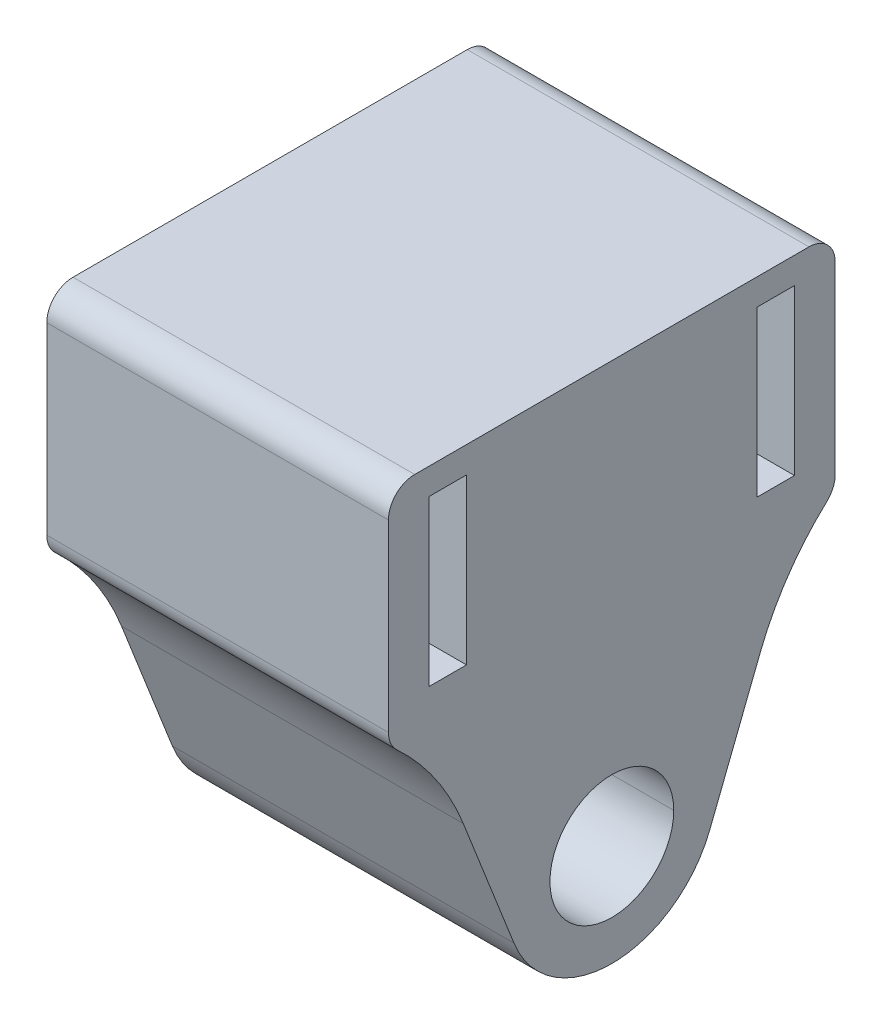
ISO-10303-21;
HEADER;
FILE_DESCRIPTION(('STEP AP214'),'2;1');
FILE_NAME('part.step','',(''),(''),'','','');
FILE_SCHEMA(('AUTOMOTIVE_DESIGN { 1 0 10303 214 1 1 1 1 }'));
ENDSEC;
DATA;
#1=APPLICATION_CONTEXT('core data for automotive mechanical design processes');
#2=APPLICATION_PROTOCOL_DEFINITION('international standard','automotive_design',2000,#1);
#3=PRODUCT_CONTEXT('',#1,'mechanical');
#4=PRODUCT('Part','Part','',(#3));
#5=PRODUCT_RELATED_PRODUCT_CATEGORY('part','',(#4));
#6=PRODUCT_DEFINITION_FORMATION('','',#4);
#7=PRODUCT_DEFINITION_CONTEXT('part definition',#1,'design');
#8=PRODUCT_DEFINITION('design','',#6,#7);
#9=PRODUCT_DEFINITION_SHAPE('','',#8);
#10=(LENGTH_UNIT() NAMED_UNIT(*) SI_UNIT(.MILLI.,.METRE.));
#11=(NAMED_UNIT(*) PLANE_ANGLE_UNIT() SI_UNIT($,.RADIAN.));
#12=(NAMED_UNIT(*) SI_UNIT($,.STERADIAN.) SOLID_ANGLE_UNIT());
#13=UNCERTAINTY_MEASURE_WITH_UNIT(LENGTH_MEASURE(1.E-05),#10,'distance_accuracy_value','');
#14=(GEOMETRIC_REPRESENTATION_CONTEXT(3) GLOBAL_UNCERTAINTY_ASSIGNED_CONTEXT((#13)) GLOBAL_UNIT_ASSIGNED_CONTEXT((#10,
#11,#12)) REPRESENTATION_CONTEXT('',''));
#15=CARTESIAN_POINT('',(0.,0.,0.));
#16=DIRECTION('',(0.,0.,1.));
#17=DIRECTION('',(1.,0.,0.));
#18=AXIS2_PLACEMENT_3D('',#15,#16,#17);
#19=CARTESIAN_POINT('',(5.,-8.06,0.));
#20=DIRECTION('',(-1.,0.,0.));
#21=DIRECTION('',(0.,0.,1.));
#22=AXIS2_PLACEMENT_3D('',#19,#20,#21);
#23=CYLINDRICAL_SURFACE('',#22,2.355);
#24=DIRECTION('',(-1.,0.,0.));
#25=VECTOR('',#24,1.);
#26=CARTESIAN_POINT('',(5.,-8.06,-2.355));
#27=LINE('',#26,#25);
#28=CARTESIAN_POINT('',(0.,-8.06,-2.355));
#29=VERTEX_POINT('',#28);
#30=CARTESIAN_POINT('',(-13.,-8.06,-2.355));
#31=VERTEX_POINT('',#30);
#32=EDGE_CURVE('E321',#29,#31,#27,.T.);
#33=ORIENTED_EDGE('',*,*,#32,.F.);
#34=CARTESIAN_POINT('',(0.,-8.06,0.));
#35=DIRECTION('',(1.,0.,0.));
#36=DIRECTION('',(0.,0.,-1.));
#37=AXIS2_PLACEMENT_3D('',#34,#35,#36);
#38=CIRCLE('',#37,2.355);
#39=CARTESIAN_POINT('',(0.,-8.06,2.355));
#40=VERTEX_POINT('',#39);
#41=EDGE_CURVE('E367',#29,#40,#38,.T.);
#42=ORIENTED_EDGE('',*,*,#41,.T.);
#43=DIRECTION('',(-1.,0.,0.));
#44=VECTOR('',#43,1.);
#45=CARTESIAN_POINT('',(5.,-8.06,2.355));
#46=LINE('',#45,#44);
#47=CARTESIAN_POINT('',(-13.,-8.06,2.355));
#48=VERTEX_POINT('',#47);
#49=EDGE_CURVE('E269',#40,#48,#46,.T.);
#50=ORIENTED_EDGE('',*,*,#49,.T.);
#51=CARTESIAN_POINT('',(-13.,-8.06,0.));
#52=DIRECTION('',(-1.,0.,0.));
#53=DIRECTION('',(0.,0.,1.));
#54=AXIS2_PLACEMENT_3D('',#51,#52,#53);
#55=CIRCLE('',#54,2.355);
#56=EDGE_CURVE('E224',#48,#31,#55,.T.);
#57=ORIENTED_EDGE('',*,*,#56,.T.);
#58=EDGE_LOOP('',(#33,#42,#50,#57));
#59=FACE_BOUND('',#58,.T.);
#60=ADVANCED_FACE('F16',(#59),#23,.F.);
#61=CARTESIAN_POINT('',(5.,6.935,-6.95));
#62=DIRECTION('',(0.,1.,0.));
#63=DIRECTION('',(0.,0.,-1.));
#64=AXIS2_PLACEMENT_3D('',#61,#62,#63);
#65=PLANE('',#64);
#66=DIRECTION('',(0.,0.,1.));
#67=VECTOR('',#66,1.);
#68=CARTESIAN_POINT('',(0.,6.935,0.));
#69=LINE('',#68,#67);
#70=CARTESIAN_POINT('',(0.,6.935,-6.95));
#71=VERTEX_POINT('',#70);
#72=CARTESIAN_POINT('',(0.,6.935,-5.53));
#73=VERTEX_POINT('',#72);
#74=EDGE_CURVE('E365',#71,#73,#69,.T.);
#75=ORIENTED_EDGE('',*,*,#74,.T.);
#76=DIRECTION('',(-1.,0.,0.));
#77=VECTOR('',#76,1.);
#78=CARTESIAN_POINT('',(5.,6.935,-5.53));
#79=LINE('',#78,#77);
#80=CARTESIAN_POINT('',(-13.,6.935,-5.53));
#81=VERTEX_POINT('',#80);
#82=EDGE_CURVE('E259',#73,#81,#79,.T.);
#83=ORIENTED_EDGE('',*,*,#82,.T.);
#84=DIRECTION('',(0.,0.,-1.));
#85=VECTOR('',#84,1.);
#86=CARTESIAN_POINT('',(-13.,6.935,-6.95));
#87=LINE('',#86,#85);
#88=CARTESIAN_POINT('',(-13.,6.935,-6.95));
#89=VERTEX_POINT('',#88);
#90=EDGE_CURVE('E425',#81,#89,#87,.T.);
#91=ORIENTED_EDGE('',*,*,#90,.T.);
#92=DIRECTION('',(-1.,0.,0.));
#93=VECTOR('',#92,1.);
#94=CARTESIAN_POINT('',(5.,6.935,-6.95));
#95=LINE('',#94,#93);
#96=EDGE_CURVE('E11',#71,#89,#95,.T.);
#97=ORIENTED_EDGE('',*,*,#96,.F.);
#98=EDGE_LOOP('',(#75,#83,#91,#97));
#99=FACE_BOUND('',#98,.T.);
#100=ADVANCED_FACE('F557',(#99),#65,.F.);
#101=CARTESIAN_POINT('',(5.,6.935,-6.95));
#102=DIRECTION('',(0.,0.,-1.));
#103=DIRECTION('',(0.,-1.,0.));
#104=AXIS2_PLACEMENT_3D('',#101,#102,#103);
#105=PLANE('',#104);
#106=DIRECTION('',(0.,1.,0.));
#107=VECTOR('',#106,1.);
#108=CARTESIAN_POINT('',(0.,-7.935,-6.95));
#109=LINE('',#108,#107);
#110=CARTESIAN_POINT('',(0.,0.675000000000008,-6.95));
#111=VERTEX_POINT('',#110);
#112=EDGE_CURVE('E377',#111,#71,#109,.T.);
#113=ORIENTED_EDGE('',*,*,#112,.T.);
#114=ORIENTED_EDGE('',*,*,#96,.T.);
#115=DIRECTION('',(0.,-1.,0.));
#116=VECTOR('',#115,1.);
#117=CARTESIAN_POINT('',(-13.,6.935,-6.95));
#118=LINE('',#117,#116);
#119=CARTESIAN_POINT('',(-13.,0.675000000000008,-6.95));
#120=VERTEX_POINT('',#119);
#121=EDGE_CURVE('E433',#89,#120,#118,.T.);
#122=ORIENTED_EDGE('',*,*,#121,.T.);
#123=DIRECTION('',(-1.,0.,0.));
#124=VECTOR('',#123,1.);
#125=CARTESIAN_POINT('',(5.,0.675000000000008,-6.95));
#126=LINE('',#125,#124);
#127=EDGE_CURVE('E27',#111,#120,#126,.T.);
#128=ORIENTED_EDGE('',*,*,#127,.F.);
#129=EDGE_LOOP('',(#113,#114,#122,#128));
#130=FACE_BOUND('',#129,.T.);
#131=ADVANCED_FACE('F530',(#130),#105,.F.);
#132=CARTESIAN_POINT('',(5.,0.675000000000008,-6.95));
#133=DIRECTION('',(0.,-1.,0.));
#134=DIRECTION('',(0.,0.,-1.));
#135=AXIS2_PLACEMENT_3D('',#132,#133,#134);
#136=PLANE('',#135);
#137=DIRECTION('',(0.,0.,-1.));
#138=VECTOR('',#137,1.);
#139=CARTESIAN_POINT('',(0.,0.675,0.));
#140=LINE('',#139,#138);
#141=CARTESIAN_POINT('',(0.,0.675,-5.53));
#142=VERTEX_POINT('',#141);
#143=EDGE_CURVE('E20',#142,#111,#140,.T.);
#144=ORIENTED_EDGE('',*,*,#143,.T.);
#145=ORIENTED_EDGE('',*,*,#127,.T.);
#146=DIRECTION('',(0.,0.,1.));
#147=VECTOR('',#146,1.);
#148=CARTESIAN_POINT('',(-13.,0.675000000000008,-6.95));
#149=LINE('',#148,#147);
#150=CARTESIAN_POINT('',(-13.,0.675,-5.53));
#151=VERTEX_POINT('',#150);
#152=EDGE_CURVE('E429',#120,#151,#149,.T.);
#153=ORIENTED_EDGE('',*,*,#152,.T.);
#154=DIRECTION('',(-1.,0.,0.));
#155=VECTOR('',#154,1.);
#156=CARTESIAN_POINT('',(5.,0.675,-5.53));
#157=LINE('',#156,#155);
#158=EDGE_CURVE('E263',#142,#151,#157,.T.);
#159=ORIENTED_EDGE('',*,*,#158,.F.);
#160=EDGE_LOOP('',(#144,#145,#153,#159));
#161=FACE_BOUND('',#160,.T.);
#162=ADVANCED_FACE('F523',(#161),#136,.F.);
#163=CARTESIAN_POINT('',(5.,6.935,-5.53));
#164=DIRECTION('',(0.,0.,1.));
#165=DIRECTION('',(0.,-1.,0.));
#166=AXIS2_PLACEMENT_3D('',#163,#164,#165);
#167=PLANE('',#166);
#168=DIRECTION('',(0.,-1.,0.));
#169=VECTOR('',#168,1.);
#170=CARTESIAN_POINT('',(0.,-7.935,-5.53));
#171=LINE('',#170,#169);
#172=EDGE_CURVE('E372',#73,#142,#171,.T.);
#173=ORIENTED_EDGE('',*,*,#172,.T.);
#174=ORIENTED_EDGE('',*,*,#158,.T.);
#175=DIRECTION('',(0.,1.,0.));
#176=VECTOR('',#175,1.);
#177=CARTESIAN_POINT('',(-13.,6.935,-5.53));
#178=LINE('',#177,#176);
#179=EDGE_CURVE('E428',#151,#81,#178,.T.);
#180=ORIENTED_EDGE('',*,*,#179,.T.);
#181=ORIENTED_EDGE('',*,*,#82,.F.);
#182=EDGE_LOOP('',(#173,#174,#180,#181));
#183=FACE_BOUND('',#182,.T.);
#184=ADVANCED_FACE('F18',(#183),#167,.F.);
#185=CARTESIAN_POINT('',(5.,6.935,5.53));
#186=DIRECTION('',(0.,1.,0.));
#187=DIRECTION('',(1.,0.,0.));
#188=AXIS2_PLACEMENT_3D('',#185,#186,#187);
#189=PLANE('',#188);
#190=DIRECTION('',(0.,0.,1.));
#191=VECTOR('',#190,1.);
#192=CARTESIAN_POINT('',(0.,6.935,0.));
#193=LINE('',#192,#191);
#194=CARTESIAN_POINT('',(0.,6.935,5.53));
#195=VERTEX_POINT('',#194);
#196=CARTESIAN_POINT('',(0.,6.935,6.95));
#197=VERTEX_POINT('',#196);
#198=EDGE_CURVE('E342',#195,#197,#193,.T.);
#199=ORIENTED_EDGE('',*,*,#198,.T.);
#200=DIRECTION('',(-1.,0.,0.));
#201=VECTOR('',#200,1.);
#202=CARTESIAN_POINT('',(5.,6.935,6.95));
#203=LINE('',#202,#201);
#204=CARTESIAN_POINT('',(-13.,6.935,6.95));
#205=VERTEX_POINT('',#204);
#206=EDGE_CURVE('E332',#197,#205,#203,.T.);
#207=ORIENTED_EDGE('',*,*,#206,.T.);
#208=DIRECTION('',(0.,0.,-1.));
#209=VECTOR('',#208,1.);
#210=CARTESIAN_POINT('',(-13.,6.935,5.53));
#211=LINE('',#210,#209);
#212=CARTESIAN_POINT('',(-13.,6.935,5.53));
#213=VERTEX_POINT('',#212);
#214=EDGE_CURVE('E293',#205,#213,#211,.T.);
#215=ORIENTED_EDGE('',*,*,#214,.T.);
#216=DIRECTION('',(-1.,0.,0.));
#217=VECTOR('',#216,1.);
#218=CARTESIAN_POINT('',(5.,6.935,5.53));
#219=LINE('',#218,#217);
#220=EDGE_CURVE('E260',#195,#213,#219,.T.);
#221=ORIENTED_EDGE('',*,*,#220,.F.);
#222=EDGE_LOOP('',(#199,#207,#215,#221));
#223=FACE_BOUND('',#222,.T.);
#224=ADVANCED_FACE('F629',(#223),#189,.F.);
#225=CARTESIAN_POINT('',(5.,0.675,5.53));
#226=DIRECTION('',(0.,0.,-1.));
#227=DIRECTION('',(-1.,0.,0.));
#228=AXIS2_PLACEMENT_3D('',#225,#226,#227);
#229=PLANE('',#228);
#230=DIRECTION('',(0.,1.,0.));
#231=VECTOR('',#230,1.);
#232=CARTESIAN_POINT('',(0.,-7.935,5.53));
#233=LINE('',#232,#231);
#234=CARTESIAN_POINT('',(0.,0.675,5.53));
#235=VERTEX_POINT('',#234);
#236=EDGE_CURVE('E339',#235,#195,#233,.T.);
#237=ORIENTED_EDGE('',*,*,#236,.T.);
#238=ORIENTED_EDGE('',*,*,#220,.T.);
#239=DIRECTION('',(0.,-1.,0.));
#240=VECTOR('',#239,1.);
#241=CARTESIAN_POINT('',(-13.,0.675,5.53));
#242=LINE('',#241,#240);
#243=CARTESIAN_POINT('',(-13.,0.675,5.53));
#244=VERTEX_POINT('',#243);
#245=EDGE_CURVE('E318',#213,#244,#242,.T.);
#246=ORIENTED_EDGE('',*,*,#245,.T.);
#247=DIRECTION('',(-1.,0.,0.));
#248=VECTOR('',#247,1.);
#249=CARTESIAN_POINT('',(5.,0.675,5.53));
#250=LINE('',#249,#248);
#251=EDGE_CURVE('E42',#235,#244,#250,.T.);
#252=ORIENTED_EDGE('',*,*,#251,.F.);
#253=EDGE_LOOP('',(#237,#238,#246,#252));
#254=FACE_BOUND('',#253,.T.);
#255=ADVANCED_FACE('F634',(#254),#229,.F.);
#256=CARTESIAN_POINT('',(5.,0.675,5.53));
#257=DIRECTION('',(0.,-1.,0.));
#258=DIRECTION('',(0.,0.,-1.));
#259=AXIS2_PLACEMENT_3D('',#256,#257,#258);
#260=PLANE('',#259);
#261=DIRECTION('',(0.,0.,-1.));
#262=VECTOR('',#261,1.);
#263=CARTESIAN_POINT('',(0.,0.675,0.));
#264=LINE('',#263,#262);
#265=CARTESIAN_POINT('',(0.,0.675,6.95));
#266=VERTEX_POINT('',#265);
#267=EDGE_CURVE('E255',#266,#235,#264,.T.);
#268=ORIENTED_EDGE('',*,*,#267,.T.);
#269=ORIENTED_EDGE('',*,*,#251,.T.);
#270=DIRECTION('',(0.,0.,1.));
#271=VECTOR('',#270,1.);
#272=CARTESIAN_POINT('',(-13.,0.675,5.53));
#273=LINE('',#272,#271);
#274=CARTESIAN_POINT('',(-13.,0.675,6.95));
#275=VERTEX_POINT('',#274);
#276=EDGE_CURVE('E292',#244,#275,#273,.T.);
#277=ORIENTED_EDGE('',*,*,#276,.T.);
#278=DIRECTION('',(-1.,0.,0.));
#279=VECTOR('',#278,1.);
#280=CARTESIAN_POINT('',(5.,0.675,6.95));
#281=LINE('',#280,#279);
#282=EDGE_CURVE('E346',#266,#275,#281,.T.);
#283=ORIENTED_EDGE('',*,*,#282,.F.);
#284=EDGE_LOOP('',(#268,#269,#277,#283));
#285=FACE_BOUND('',#284,.T.);
#286=ADVANCED_FACE('F749',(#285),#260,.F.);
#287=CARTESIAN_POINT('',(5.,0.675,6.95));
#288=DIRECTION('',(0.,0.,1.));
#289=DIRECTION('',(0.,-1.,0.));
#290=AXIS2_PLACEMENT_3D('',#287,#288,#289);
#291=PLANE('',#290);
#292=DIRECTION('',(0.,-1.,0.));
#293=VECTOR('',#292,1.);
#294=CARTESIAN_POINT('',(0.,-7.935,6.95));
#295=LINE('',#294,#293);
#296=EDGE_CURVE('E383',#197,#266,#295,.T.);
#297=ORIENTED_EDGE('',*,*,#296,.T.);
#298=ORIENTED_EDGE('',*,*,#282,.T.);
#299=DIRECTION('',(0.,1.,0.));
#300=VECTOR('',#299,1.);
#301=CARTESIAN_POINT('',(-13.,0.675,6.95));
#302=LINE('',#301,#300);
#303=EDGE_CURVE('E288',#275,#205,#302,.T.);
#304=ORIENTED_EDGE('',*,*,#303,.T.);
#305=ORIENTED_EDGE('',*,*,#206,.F.);
#306=EDGE_LOOP('',(#297,#298,#304,#305));
#307=FACE_BOUND('',#306,.T.);
#308=ADVANCED_FACE('F718',(#307),#291,.F.);
#309=CARTESIAN_POINT('',(-13.,-8.14934996185725,14.9594427200843));
#310=DIRECTION('',(1.,0.,0.));
#311=DIRECTION('',(0.,0.,-1.));
#312=AXIS2_PLACEMENT_3D('',#309,#310,#311);
#313=CYLINDRICAL_SURFACE('',#312,10.);
#314=CARTESIAN_POINT('',(-13.,-8.14934996185725,14.9594427200843));
#315=DIRECTION('',(1.,0.,0.));
#316=DIRECTION('',(0.,0.,-1.));
#317=AXIS2_PLACEMENT_3D('',#314,#315,#316);
#318=CIRCLE('',#317,10.);
#319=CARTESIAN_POINT('',(-13.,-4.48947055501801,5.6532467879435));
#320=VERTEX_POINT('',#319);
#321=CARTESIAN_POINT('',(-13.,-0.799940905623382,8.1781311563713));
#322=VERTEX_POINT('',#321);
#323=EDGE_CURVE('E337',#320,#322,#318,.T.);
#324=ORIENTED_EDGE('',*,*,#323,.F.);
#325=DIRECTION('',(-1.,0.,0.));
#326=VECTOR('',#325,1.);
#327=CARTESIAN_POINT('',(-13.,-4.48947055501801,5.6532467879435));
#328=LINE('',#327,#326);
#329=CARTESIAN_POINT('',(0.,-4.48947055501801,5.6532467879435));
#330=VERTEX_POINT('',#329);
#331=EDGE_CURVE('E300',#330,#320,#328,.T.);
#332=ORIENTED_EDGE('',*,*,#331,.F.);
#333=CARTESIAN_POINT('',(0.,-8.14934996185725,14.9594427200843));
#334=DIRECTION('',(-1.,0.,0.));
#335=DIRECTION('',(0.,0.,-1.));
#336=AXIS2_PLACEMENT_3D('',#333,#334,#335);
#337=CIRCLE('',#336,10.);
#338=CARTESIAN_POINT('',(0.,-0.799940905623382,8.1781311563713));
#339=VERTEX_POINT('',#338);
#340=EDGE_CURVE('E62',#339,#330,#337,.T.);
#341=ORIENTED_EDGE('',*,*,#340,.F.);
#342=DIRECTION('',(1.,0.,0.));
#343=VECTOR('',#342,1.);
#344=CARTESIAN_POINT('',(-13.,-0.799940905623382,8.1781311563713));
#345=LINE('',#344,#343);
#346=EDGE_CURVE('E254',#322,#339,#345,.T.);
#347=ORIENTED_EDGE('',*,*,#346,.F.);
#348=EDGE_LOOP('',(#324,#332,#341,#347));
#349=FACE_BOUND('',#348,.T.);
#350=ADVANCED_FACE('F713',(#349),#313,.F.);
#351=CARTESIAN_POINT('',(-13.,-8.14934996185724,-14.9594427200843));
#352=DIRECTION('',(1.,0.,0.));
#353=DIRECTION('',(0.,0.,-1.));
#354=AXIS2_PLACEMENT_3D('',#351,#352,#353);
#355=CYLINDRICAL_SURFACE('',#354,10.);
#356=CARTESIAN_POINT('',(-13.,-8.14934996185724,-14.9594427200843));
#357=DIRECTION('',(1.,0.,0.));
#358=DIRECTION('',(0.,0.,-1.));
#359=AXIS2_PLACEMENT_3D('',#356,#357,#358);
#360=CIRCLE('',#359,10.);
#361=CARTESIAN_POINT('',(-13.,-0.79994090562338,-8.1781311563713));
#362=VERTEX_POINT('',#361);
#363=CARTESIAN_POINT('',(-13.,-4.48947055501799,-5.6532467879435));
#364=VERTEX_POINT('',#363);
#365=EDGE_CURVE('E333',#362,#364,#360,.T.);
#366=ORIENTED_EDGE('',*,*,#365,.F.);
#367=DIRECTION('',(-1.,0.,0.));
#368=VECTOR('',#367,1.);
#369=CARTESIAN_POINT('',(-13.,-0.79994090562338,-8.1781311563713));
#370=LINE('',#369,#368);
#371=CARTESIAN_POINT('',(0.,-0.79994090562338,-8.1781311563713));
#372=VERTEX_POINT('',#371);
#373=EDGE_CURVE('E251',#372,#362,#370,.T.);
#374=ORIENTED_EDGE('',*,*,#373,.F.);
#375=CARTESIAN_POINT('',(0.,-8.14934996185724,-14.9594427200843));
#376=DIRECTION('',(-1.,0.,0.));
#377=DIRECTION('',(0.,0.,-1.));
#378=AXIS2_PLACEMENT_3D('',#375,#376,#377);
#379=CIRCLE('',#378,10.);
#380=CARTESIAN_POINT('',(0.,-4.48947055501799,-5.6532467879435));
#381=VERTEX_POINT('',#380);
#382=EDGE_CURVE('E312',#381,#372,#379,.T.);
#383=ORIENTED_EDGE('',*,*,#382,.F.);
#384=DIRECTION('',(1.,0.,0.));
#385=VECTOR('',#384,1.);
#386=CARTESIAN_POINT('',(0.,-4.489470555018,-5.6532467879435));
#387=LINE('',#386,#385);
#388=EDGE_CURVE('E315',#364,#381,#387,.T.);
#389=ORIENTED_EDGE('',*,*,#388,.F.);
#390=EDGE_LOOP('',(#366,#374,#383,#389));
#391=FACE_BOUND('',#390,.T.);
#392=ADVANCED_FACE('F454',(#391),#355,.F.);
#393=CARTESIAN_POINT('',(-13.,6.935,7.5));
#394=DIRECTION('',(1.,0.,0.));
#395=DIRECTION('',(0.,0.,-1.));
#396=AXIS2_PLACEMENT_3D('',#393,#394,#395);
#397=CYLINDRICAL_SURFACE('',#396,1.);
#398=CARTESIAN_POINT('',(-13.,6.935,7.5));
#399=DIRECTION('',(-1.,0.,0.));
#400=DIRECTION('',(0.,0.,-1.));
#401=AXIS2_PLACEMENT_3D('',#398,#399,#400);
#402=CIRCLE('',#401,1.);
#403=CARTESIAN_POINT('',(-13.,6.935,8.5));
#404=VERTEX_POINT('',#403);
#405=CARTESIAN_POINT('',(-13.,7.935,7.5));
#406=VERTEX_POINT('',#405);
#407=EDGE_CURVE('E225',#404,#406,#402,.T.);
#408=ORIENTED_EDGE('',*,*,#407,.F.);
#409=DIRECTION('',(-1.,0.,0.));
#410=VECTOR('',#409,1.);
#411=CARTESIAN_POINT('',(-13.,6.935,8.5));
#412=LINE('',#411,#410);
#413=CARTESIAN_POINT('',(0.,6.935,8.5));
#414=VERTEX_POINT('',#413);
#415=EDGE_CURVE('E274',#414,#404,#412,.T.);
#416=ORIENTED_EDGE('',*,*,#415,.F.);
#417=CARTESIAN_POINT('',(0.,6.935,7.5));
#418=DIRECTION('',(1.,0.,0.));
#419=DIRECTION('',(0.,0.,-1.));
#420=AXIS2_PLACEMENT_3D('',#417,#418,#419);
#421=CIRCLE('',#420,1.);
#422=CARTESIAN_POINT('',(0.,7.935,7.5));
#423=VERTEX_POINT('',#422);
#424=EDGE_CURVE('E122',#423,#414,#421,.T.);
#425=ORIENTED_EDGE('',*,*,#424,.F.);
#426=DIRECTION('',(1.,0.,0.));
#427=VECTOR('',#426,1.);
#428=CARTESIAN_POINT('',(-13.,7.935,7.5));
#429=LINE('',#428,#427);
#430=EDGE_CURVE('E423',#406,#423,#429,.T.);
#431=ORIENTED_EDGE('',*,*,#430,.F.);
#432=EDGE_LOOP('',(#408,#416,#425,#431));
#433=FACE_BOUND('',#432,.T.);
#434=ADVANCED_FACE('F728',(#433),#397,.T.);
#435=CARTESIAN_POINT('',(-13.,6.935,-7.5));
#436=DIRECTION('',(1.,0.,0.));
#437=DIRECTION('',(0.,0.,-1.));
#438=AXIS2_PLACEMENT_3D('',#435,#436,#437);
#439=CYLINDRICAL_SURFACE('',#438,1.);
#440=CARTESIAN_POINT('',(-13.,6.935,-7.5));
#441=DIRECTION('',(-1.,0.,0.));
#442=DIRECTION('',(0.,0.,-1.));
#443=AXIS2_PLACEMENT_3D('',#440,#441,#442);
#444=CIRCLE('',#443,1.);
#445=CARTESIAN_POINT('',(-13.,7.935,-7.5));
#446=VERTEX_POINT('',#445);
#447=CARTESIAN_POINT('',(-13.,6.935,-8.5));
#448=VERTEX_POINT('',#447);
#449=EDGE_CURVE('E211',#446,#448,#444,.T.);
#450=ORIENTED_EDGE('',*,*,#449,.F.);
#451=DIRECTION('',(-1.,0.,0.));
#452=VECTOR('',#451,1.);
#453=CARTESIAN_POINT('',(-13.,7.935,-7.5));
#454=LINE('',#453,#452);
#455=CARTESIAN_POINT('',(0.,7.935,-7.5));
#456=VERTEX_POINT('',#455);
#457=EDGE_CURVE('E278',#456,#446,#454,.T.);
#458=ORIENTED_EDGE('',*,*,#457,.F.);
#459=CARTESIAN_POINT('',(0.,6.935,-7.5));
#460=DIRECTION('',(1.,0.,0.));
#461=DIRECTION('',(0.,0.,-1.));
#462=AXIS2_PLACEMENT_3D('',#459,#460,#461);
#463=CIRCLE('',#462,1.);
#464=CARTESIAN_POINT('',(0.,6.935,-8.5));
#465=VERTEX_POINT('',#464);
#466=EDGE_CURVE('E139',#465,#456,#463,.T.);
#467=ORIENTED_EDGE('',*,*,#466,.F.);
#468=DIRECTION('',(1.,0.,0.));
#469=VECTOR('',#468,1.);
#470=CARTESIAN_POINT('',(-13.,6.935,-8.5));
#471=LINE('',#470,#469);
#472=EDGE_CURVE('E228',#448,#465,#471,.T.);
#473=ORIENTED_EDGE('',*,*,#472,.F.);
#474=EDGE_LOOP('',(#450,#458,#467,#473));
#475=FACE_BOUND('',#474,.T.);
#476=ADVANCED_FACE('F229',(#475),#439,.T.);
#477=CARTESIAN_POINT('',(-13.,-0.0649999999999956,7.5));
#478=DIRECTION('',(1.,0.,0.));
#479=DIRECTION('',(0.,0.,-1.));
#480=AXIS2_PLACEMENT_3D('',#477,#478,#479);
#481=CYLINDRICAL_SURFACE('',#480,1.);
#482=CARTESIAN_POINT('',(-13.,-0.0649999999999956,7.5));
#483=DIRECTION('',(-1.,0.,0.));
#484=DIRECTION('',(0.,0.,-1.));
#485=AXIS2_PLACEMENT_3D('',#482,#483,#484);
#486=CIRCLE('',#485,1.);
#487=CARTESIAN_POINT('',(-13.,-0.0649999999999956,8.5));
#488=VERTEX_POINT('',#487);
#489=EDGE_CURVE('E376',#322,#488,#486,.T.);
#490=ORIENTED_EDGE('',*,*,#489,.F.);
#491=ORIENTED_EDGE('',*,*,#346,.T.);
#492=CARTESIAN_POINT('',(0.,-0.0649999999999956,7.5));
#493=DIRECTION('',(1.,0.,0.));
#494=DIRECTION('',(0.,0.,-1.));
#495=AXIS2_PLACEMENT_3D('',#492,#493,#494);
#496=CIRCLE('',#495,1.);
#497=CARTESIAN_POINT('',(0.,-0.0649999999999956,8.5));
#498=VERTEX_POINT('',#497);
#499=EDGE_CURVE('E285',#498,#339,#496,.T.);
#500=ORIENTED_EDGE('',*,*,#499,.F.);
#501=DIRECTION('',(1.,0.,0.));
#502=VECTOR('',#501,1.);
#503=CARTESIAN_POINT('',(-13.,-0.0649999999999956,8.5));
#504=LINE('',#503,#502);
#505=EDGE_CURVE('E249',#488,#498,#504,.T.);
#506=ORIENTED_EDGE('',*,*,#505,.F.);
#507=EDGE_LOOP('',(#490,#491,#500,#506));
#508=FACE_BOUND('',#507,.T.);
#509=ADVANCED_FACE('F565',(#508),#481,.T.);
#510=CARTESIAN_POINT('',(-13.,-0.0649999999999938,-7.5));
#511=DIRECTION('',(1.,0.,0.));
#512=DIRECTION('',(0.,0.,-1.));
#513=AXIS2_PLACEMENT_3D('',#510,#511,#512);
#514=CYLINDRICAL_SURFACE('',#513,1.);
#515=CARTESIAN_POINT('',(0.,-0.0649999999999938,-7.5));
#516=DIRECTION('',(1.,0.,0.));
#517=DIRECTION('',(0.,0.,-1.));
#518=AXIS2_PLACEMENT_3D('',#515,#516,#517);
#519=CIRCLE('',#518,1.);
#520=CARTESIAN_POINT('',(0.,-0.0649999999999939,-8.5));
#521=VERTEX_POINT('',#520);
#522=EDGE_CURVE('E306',#372,#521,#519,.T.);
#523=ORIENTED_EDGE('',*,*,#522,.F.);
#524=ORIENTED_EDGE('',*,*,#373,.T.);
#525=CARTESIAN_POINT('',(-13.,-0.0649999999999938,-7.5));
#526=DIRECTION('',(-1.,0.,0.));
#527=DIRECTION('',(0.,0.,-1.));
#528=AXIS2_PLACEMENT_3D('',#525,#526,#527);
#529=CIRCLE('',#528,1.);
#530=CARTESIAN_POINT('',(-13.,-0.0649999999999939,-8.5));
#531=VERTEX_POINT('',#530);
#532=EDGE_CURVE('E338',#531,#362,#529,.T.);
#533=ORIENTED_EDGE('',*,*,#532,.F.);
#534=DIRECTION('',(-1.,0.,0.));
#535=VECTOR('',#534,1.);
#536=CARTESIAN_POINT('',(-13.,-0.0649999999999939,-8.5));
#537=LINE('',#536,#535);
#538=EDGE_CURVE('E237',#521,#531,#537,.T.);
#539=ORIENTED_EDGE('',*,*,#538,.F.);
#540=EDGE_LOOP('',(#523,#524,#533,#539));
#541=FACE_BOUND('',#540,.T.);
#542=ADVANCED_FACE('F456',(#541),#514,.T.);
#543=CARTESIAN_POINT('',(0.,-7.935,0.));
#544=DIRECTION('',(1.,0.,0.));
#545=DIRECTION('',(0.,1.,0.));
#546=AXIS2_PLACEMENT_3D('',#543,#544,#545);
#547=PLANE('',#546);
#548=ORIENTED_EDGE('',*,*,#296,.F.);
#549=ORIENTED_EDGE('',*,*,#198,.F.);
#550=ORIENTED_EDGE('',*,*,#236,.F.);
#551=ORIENTED_EDGE('',*,*,#267,.F.);
#552=EDGE_LOOP('',(#548,#549,#550,#551));
#553=FACE_BOUND('',#552,.T.);
#554=ORIENTED_EDGE('',*,*,#172,.F.);
#555=ORIENTED_EDGE('',*,*,#74,.F.);
#556=ORIENTED_EDGE('',*,*,#112,.F.);
#557=ORIENTED_EDGE('',*,*,#143,.F.);
#558=EDGE_LOOP('',(#554,#555,#556,#557));
#559=FACE_BOUND('',#558,.T.);
#560=CARTESIAN_POINT('',(0.,-8.06,0.));
#561=DIRECTION('',(1.,0.,0.));
#562=DIRECTION('',(0.,0.,-1.));
#563=AXIS2_PLACEMENT_3D('',#560,#561,#562);
#564=CIRCLE('',#563,2.355);
#565=EDGE_CURVE('E326',#40,#29,#564,.T.);
#566=ORIENTED_EDGE('',*,*,#565,.F.);
#567=ORIENTED_EDGE('',*,*,#41,.F.);
#568=EDGE_LOOP('',(#566,#567));
#569=FACE_BOUND('',#568,.T.);
#570=DIRECTION('',(0.,0.93061959321408,-0.365987940683924));
#571=VECTOR('',#570,1.);
#572=CARTESIAN_POINT('',(0.,-9.39895176273569,-3.72247837285632));
#573=LINE('',#572,#571);
#574=CARTESIAN_POINT('',(0.,-9.39895176273569,-3.72247837285632));
#575=VERTEX_POINT('',#574);
#576=EDGE_CURVE('E284',#575,#381,#573,.T.);
#577=ORIENTED_EDGE('',*,*,#576,.T.);
#578=ORIENTED_EDGE('',*,*,#382,.T.);
#579=ORIENTED_EDGE('',*,*,#522,.T.);
#580=DIRECTION('',(0.,1.,0.));
#581=VECTOR('',#580,1.);
#582=CARTESIAN_POINT('',(0.,7.935,-8.5));
#583=LINE('',#582,#581);
#584=EDGE_CURVE('E245',#521,#465,#583,.T.);
#585=ORIENTED_EDGE('',*,*,#584,.T.);
#586=ORIENTED_EDGE('',*,*,#466,.T.);
#587=DIRECTION('',(0.,0.,1.));
#588=VECTOR('',#587,1.);
#589=CARTESIAN_POINT('',(0.,7.935,8.5));
#590=LINE('',#589,#588);
#591=EDGE_CURVE('E275',#456,#423,#590,.T.);
#592=ORIENTED_EDGE('',*,*,#591,.T.);
#593=ORIENTED_EDGE('',*,*,#424,.T.);
#594=DIRECTION('',(0.,-1.,0.));
#595=VECTOR('',#594,1.);
#596=CARTESIAN_POINT('',(0.,7.935,8.5));
#597=LINE('',#596,#595);
#598=EDGE_CURVE('E270',#414,#498,#597,.T.);
#599=ORIENTED_EDGE('',*,*,#598,.T.);
#600=ORIENTED_EDGE('',*,*,#499,.T.);
#601=ORIENTED_EDGE('',*,*,#340,.T.);
#602=DIRECTION('',(0.,-0.93061959321408,-0.365987940683924));
#603=VECTOR('',#602,1.);
#604=CARTESIAN_POINT('',(0.,-9.3989517627357,3.72247837285632));
#605=LINE('',#604,#603);
#606=CARTESIAN_POINT('',(0.,-9.3989517627357,3.72247837285632));
#607=VERTEX_POINT('',#606);
#608=EDGE_CURVE('E297',#330,#607,#605,.T.);
#609=ORIENTED_EDGE('',*,*,#608,.T.);
#610=CARTESIAN_POINT('',(0.,-7.935,0.));
#611=DIRECTION('',(1.,0.,0.));
#612=DIRECTION('',(0.,0.,-1.));
#613=AXIS2_PLACEMENT_3D('',#610,#611,#612);
#614=CIRCLE('',#613,4.);
#615=EDGE_CURVE('E283',#607,#575,#614,.T.);
#616=ORIENTED_EDGE('',*,*,#615,.T.);
#617=EDGE_LOOP('',(#577,#578,#579,#585,#586,#592,#593,#599,#600,#601,#609,#616));
#618=FACE_BOUND('',#617,.T.);
#619=ADVANCED_FACE('F400',(#553,#559,#569,#618),#547,.T.);
#620=CARTESIAN_POINT('',(-13.,-7.935,0.));
#621=DIRECTION('',(1.,0.,0.));
#622=DIRECTION('',(0.,1.,0.));
#623=AXIS2_PLACEMENT_3D('',#620,#621,#622);
#624=PLANE('',#623);
#625=ORIENTED_EDGE('',*,*,#214,.F.);
#626=ORIENTED_EDGE('',*,*,#303,.F.);
#627=ORIENTED_EDGE('',*,*,#276,.F.);
#628=ORIENTED_EDGE('',*,*,#245,.F.);
#629=EDGE_LOOP('',(#625,#626,#627,#628));
#630=FACE_BOUND('',#629,.T.);
#631=ORIENTED_EDGE('',*,*,#90,.F.);
#632=ORIENTED_EDGE('',*,*,#179,.F.);
#633=ORIENTED_EDGE('',*,*,#152,.F.);
#634=ORIENTED_EDGE('',*,*,#121,.F.);
#635=EDGE_LOOP('',(#631,#632,#633,#634));
#636=FACE_BOUND('',#635,.T.);
#637=ORIENTED_EDGE('',*,*,#56,.F.);
#638=CARTESIAN_POINT('',(-13.,-8.06,0.));
#639=DIRECTION('',(-1.,0.,0.));
#640=DIRECTION('',(0.,0.,1.));
#641=AXIS2_PLACEMENT_3D('',#638,#639,#640);
#642=CIRCLE('',#641,2.355);
#643=EDGE_CURVE('E325',#31,#48,#642,.T.);
#644=ORIENTED_EDGE('',*,*,#643,.F.);
#645=EDGE_LOOP('',(#637,#644));
#646=FACE_BOUND('',#645,.T.);
#647=DIRECTION('',(0.,1.,0.));
#648=VECTOR('',#647,1.);
#649=CARTESIAN_POINT('',(-13.,7.935,-8.5));
#650=LINE('',#649,#648);
#651=EDGE_CURVE('E216',#531,#448,#650,.T.);
#652=ORIENTED_EDGE('',*,*,#651,.F.);
#653=ORIENTED_EDGE('',*,*,#532,.T.);
#654=ORIENTED_EDGE('',*,*,#365,.T.);
#655=DIRECTION('',(0.,0.93061959321408,-0.365987940683924));
#656=VECTOR('',#655,1.);
#657=CARTESIAN_POINT('',(-13.,-9.39895176273569,-3.72247837285632));
#658=LINE('',#657,#656);
#659=CARTESIAN_POINT('',(-13.,-9.39895176273569,-3.72247837285632));
#660=VERTEX_POINT('',#659);
#661=EDGE_CURVE('E233',#660,#364,#658,.T.);
#662=ORIENTED_EDGE('',*,*,#661,.F.);
#663=CARTESIAN_POINT('',(-13.,-7.935,0.));
#664=DIRECTION('',(1.,0.,0.));
#665=DIRECTION('',(0.,0.,-1.));
#666=AXIS2_PLACEMENT_3D('',#663,#664,#665);
#667=CIRCLE('',#666,4.);
#668=CARTESIAN_POINT('',(-13.,-9.3989517627357,3.72247837285632));
#669=VERTEX_POINT('',#668);
#670=EDGE_CURVE('E294',#669,#660,#667,.T.);
#671=ORIENTED_EDGE('',*,*,#670,.F.);
#672=DIRECTION('',(0.,-0.93061959321408,-0.365987940683924));
#673=VECTOR('',#672,1.);
#674=CARTESIAN_POINT('',(-13.,-9.3989517627357,3.72247837285632));
#675=LINE('',#674,#673);
#676=EDGE_CURVE('E80',#320,#669,#675,.T.);
#677=ORIENTED_EDGE('',*,*,#676,.F.);
#678=ORIENTED_EDGE('',*,*,#323,.T.);
#679=ORIENTED_EDGE('',*,*,#489,.T.);
#680=DIRECTION('',(0.,-1.,0.));
#681=VECTOR('',#680,1.);
#682=CARTESIAN_POINT('',(-13.,7.935,8.5));
#683=LINE('',#682,#681);
#684=EDGE_CURVE('E265',#404,#488,#683,.T.);
#685=ORIENTED_EDGE('',*,*,#684,.F.);
#686=ORIENTED_EDGE('',*,*,#407,.T.);
#687=DIRECTION('',(0.,0.,1.));
#688=VECTOR('',#687,1.);
#689=CARTESIAN_POINT('',(-13.,7.935,8.5));
#690=LINE('',#689,#688);
#691=EDGE_CURVE('E220',#446,#406,#690,.T.);
#692=ORIENTED_EDGE('',*,*,#691,.F.);
#693=ORIENTED_EDGE('',*,*,#449,.T.);
#694=EDGE_LOOP('',(#652,#653,#654,#662,#671,#677,#678,#679,#685,#686,#692,#693));
#695=FACE_BOUND('',#694,.T.);
#696=ADVANCED_FACE('F213',(#630,#636,#646,#695),#624,.F.);
#697=CARTESIAN_POINT('',(-13.,-9.3989517627357,3.72247837285632));
#698=DIRECTION('',(0.,-0.365987940683924,0.93061959321408));
#699=DIRECTION('',(-1.,0.,0.));
#700=AXIS2_PLACEMENT_3D('',#697,#698,#699);
#701=PLANE('',#700);
#702=ORIENTED_EDGE('',*,*,#608,.F.);
#703=ORIENTED_EDGE('',*,*,#331,.T.);
#704=ORIENTED_EDGE('',*,*,#676,.T.);
#705=DIRECTION('',(1.,0.,0.));
#706=VECTOR('',#705,1.);
#707=CARTESIAN_POINT('',(-13.,-9.3989517627357,3.72247837285632));
#708=LINE('',#707,#706);
#709=EDGE_CURVE('E298',#669,#607,#708,.T.);
#710=ORIENTED_EDGE('',*,*,#709,.T.);
#711=EDGE_LOOP('',(#702,#703,#704,#710));
#712=FACE_BOUND('',#711,.T.);
#713=ADVANCED_FACE('F583',(#712),#701,.T.);
#714=CARTESIAN_POINT('',(-13.,-7.935,0.));
#715=DIRECTION('',(1.,0.,0.));
#716=DIRECTION('',(0.,0.,-1.));
#717=AXIS2_PLACEMENT_3D('',#714,#715,#716);
#718=CYLINDRICAL_SURFACE('',#717,4.);
#719=ORIENTED_EDGE('',*,*,#615,.F.);
#720=ORIENTED_EDGE('',*,*,#709,.F.);
#721=ORIENTED_EDGE('',*,*,#670,.T.);
#722=DIRECTION('',(1.,0.,0.));
#723=VECTOR('',#722,1.);
#724=CARTESIAN_POINT('',(-13.,-9.39895176273569,-3.72247837285632));
#725=LINE('',#724,#723);
#726=EDGE_CURVE('E279',#660,#575,#725,.T.);
#727=ORIENTED_EDGE('',*,*,#726,.T.);
#728=EDGE_LOOP('',(#719,#720,#721,#727));
#729=FACE_BOUND('',#728,.T.);
#730=ADVANCED_FACE('F410',(#729),#718,.T.);
#731=CARTESIAN_POINT('',(-13.,-9.39895176273569,-3.72247837285632));
#732=DIRECTION('',(0.,-0.365987940683924,-0.93061959321408));
#733=DIRECTION('',(0.,-0.93061959321408,0.365987940683924));
#734=AXIS2_PLACEMENT_3D('',#731,#732,#733);
#735=PLANE('',#734);
#736=ORIENTED_EDGE('',*,*,#661,.T.);
#737=ORIENTED_EDGE('',*,*,#388,.T.);
#738=ORIENTED_EDGE('',*,*,#576,.F.);
#739=ORIENTED_EDGE('',*,*,#726,.F.);
#740=EDGE_LOOP('',(#736,#737,#738,#739));
#741=FACE_BOUND('',#740,.T.);
#742=ADVANCED_FACE('F413',(#741),#735,.T.);
#743=CARTESIAN_POINT('',(-13.,7.935,-8.5));
#744=DIRECTION('',(0.,0.,-1.));
#745=DIRECTION('',(-1.,0.,0.));
#746=AXIS2_PLACEMENT_3D('',#743,#744,#745);
#747=PLANE('',#746);
#748=ORIENTED_EDGE('',*,*,#584,.F.);
#749=ORIENTED_EDGE('',*,*,#538,.T.);
#750=ORIENTED_EDGE('',*,*,#651,.T.);
#751=ORIENTED_EDGE('',*,*,#472,.T.);
#752=EDGE_LOOP('',(#748,#749,#750,#751));
#753=FACE_BOUND('',#752,.T.);
#754=ADVANCED_FACE('F235',(#753),#747,.T.);
#755=CARTESIAN_POINT('',(-13.,7.935,8.5));
#756=DIRECTION('',(0.,1.,0.));
#757=DIRECTION('',(0.,0.,-1.));
#758=AXIS2_PLACEMENT_3D('',#755,#756,#757);
#759=PLANE('',#758);
#760=ORIENTED_EDGE('',*,*,#591,.F.);
#761=ORIENTED_EDGE('',*,*,#457,.T.);
#762=ORIENTED_EDGE('',*,*,#691,.T.);
#763=ORIENTED_EDGE('',*,*,#430,.T.);
#764=EDGE_LOOP('',(#760,#761,#762,#763));
#765=FACE_BOUND('',#764,.T.);
#766=ADVANCED_FACE('F647',(#765),#759,.T.);
#767=CARTESIAN_POINT('',(-13.,7.935,8.5));
#768=DIRECTION('',(0.,0.,1.));
#769=DIRECTION('',(0.,-1.,0.));
#770=AXIS2_PLACEMENT_3D('',#767,#768,#769);
#771=PLANE('',#770);
#772=ORIENTED_EDGE('',*,*,#684,.T.);
#773=ORIENTED_EDGE('',*,*,#505,.T.);
#774=ORIENTED_EDGE('',*,*,#598,.F.);
#775=ORIENTED_EDGE('',*,*,#415,.T.);
#776=EDGE_LOOP('',(#772,#773,#774,#775));
#777=FACE_BOUND('',#776,.T.);
#778=ADVANCED_FACE('F609',(#777),#771,.T.);
#779=CARTESIAN_POINT('',(5.,-8.06,0.));
#780=DIRECTION('',(-1.,0.,0.));
#781=DIRECTION('',(0.,0.,1.));
#782=AXIS2_PLACEMENT_3D('',#779,#780,#781);
#783=CYLINDRICAL_SURFACE('',#782,2.355);
#784=ORIENTED_EDGE('',*,*,#565,.T.);
#785=ORIENTED_EDGE('',*,*,#32,.T.);
#786=ORIENTED_EDGE('',*,*,#643,.T.);
#787=ORIENTED_EDGE('',*,*,#49,.F.);
#788=EDGE_LOOP('',(#784,#785,#786,#787));
#789=FACE_BOUND('',#788,.T.);
#790=ADVANCED_FACE('F604',(#789),#783,.F.);
#791=CLOSED_SHELL('',(#60,#100,#131,#162,#184,#224,#255,#286,#308,#350,#392,#434,#476,#509,#542,
#619,#696,#713,#730,#742,#754,#766,#778,#790));
#792=MANIFOLD_SOLID_BREP('B1',#791);
#793=ADVANCED_BREP_SHAPE_REPRESENTATION('',(#18,#792),#14);
#794=SHAPE_DEFINITION_REPRESENTATION(#9,#793);
ENDSEC;
END-ISO-10303-21;
